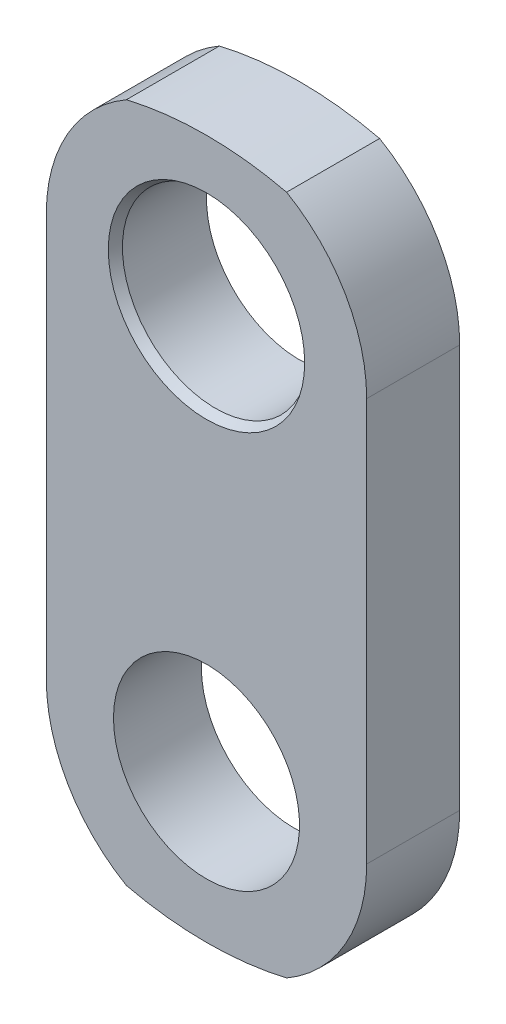
ISO-10303-21;
HEADER;
FILE_DESCRIPTION(('STEP AP214'),'2;1');
FILE_NAME('part.step','',(''),(''),'','','');
FILE_SCHEMA(('AUTOMOTIVE_DESIGN { 1 0 10303 214 1 1 1 1 }'));
ENDSEC;
DATA;
#1=APPLICATION_CONTEXT('core data for automotive mechanical design processes');
#2=APPLICATION_PROTOCOL_DEFINITION('international standard','automotive_design',2000,#1);
#3=PRODUCT_CONTEXT('',#1,'mechanical');
#4=PRODUCT('Part','Part','',(#3));
#5=PRODUCT_RELATED_PRODUCT_CATEGORY('part','',(#4));
#6=PRODUCT_DEFINITION_FORMATION('','',#4);
#7=PRODUCT_DEFINITION_CONTEXT('part definition',#1,'design');
#8=PRODUCT_DEFINITION('design','',#6,#7);
#9=PRODUCT_DEFINITION_SHAPE('','',#8);
#10=(LENGTH_UNIT() NAMED_UNIT(*) SI_UNIT(.MILLI.,.METRE.));
#11=(NAMED_UNIT(*) PLANE_ANGLE_UNIT() SI_UNIT($,.RADIAN.));
#12=(NAMED_UNIT(*) SI_UNIT($,.STERADIAN.) SOLID_ANGLE_UNIT());
#13=UNCERTAINTY_MEASURE_WITH_UNIT(LENGTH_MEASURE(1.E-05),#10,'distance_accuracy_value','');
#14=(GEOMETRIC_REPRESENTATION_CONTEXT(3) GLOBAL_UNCERTAINTY_ASSIGNED_CONTEXT((#13)) GLOBAL_UNIT_ASSIGNED_CONTEXT((#10,
#11,#12)) REPRESENTATION_CONTEXT('',''));
#15=CARTESIAN_POINT('',(0.,0.,0.));
#16=DIRECTION('',(0.,0.,1.));
#17=DIRECTION('',(1.,0.,0.));
#18=AXIS2_PLACEMENT_3D('',#15,#16,#17);
#19=CARTESIAN_POINT('',(0.,39.,18.));
#20=DIRECTION('',(0.,0.,1.));
#21=DIRECTION('',(1.,0.,0.));
#22=AXIS2_PLACEMENT_3D('',#19,#20,#21);
#23=PLANE('',#22);
#24=CARTESIAN_POINT('',(0.,39.,18.));
#25=DIRECTION('',(0.,0.,1.));
#26=DIRECTION('',(1.,0.,0.));
#27=AXIS2_PLACEMENT_3D('',#24,#25,#26);
#28=CIRCLE('',#27,19.);
#29=CARTESIAN_POINT('',(19.,39.,18.));
#30=VERTEX_POINT('',#29);
#31=EDGE_CURVE('E166',#30,#30,#28,.F.);
#32=ORIENTED_EDGE('',*,*,#31,.T.);
#33=EDGE_LOOP('',(#32));
#34=FACE_BOUND('',#33,.T.);
#35=CARTESIAN_POINT('',(0.,39.,18.));
#36=DIRECTION('',(0.,0.,1.));
#37=DIRECTION('',(1.,0.,0.));
#38=AXIS2_PLACEMENT_3D('',#35,#36,#37);
#39=CIRCLE('',#38,31.);
#40=CARTESIAN_POINT('',(31.,39.,18.));
#41=VERTEX_POINT('',#40);
#42=CARTESIAN_POINT('',(15.4999999999999,65.8467875173176,18.));
#43=VERTEX_POINT('',#42);
#44=EDGE_CURVE('E148',#41,#43,#39,.T.);
#45=ORIENTED_EDGE('',*,*,#44,.T.);
#46=CARTESIAN_POINT('',(0.,0.,18.));
#47=DIRECTION('',(0.,0.,1.));
#48=DIRECTION('',(1.,0.,0.));
#49=AXIS2_PLACEMENT_3D('',#46,#47,#48);
#50=CIRCLE('',#49,67.6465034303383);
#51=CARTESIAN_POINT('',(-15.4999999999999,65.8467875173176,18.));
#52=VERTEX_POINT('',#51);
#53=EDGE_CURVE('E96',#43,#52,#50,.T.);
#54=ORIENTED_EDGE('',*,*,#53,.T.);
#55=CARTESIAN_POINT('',(0.,39.,18.));
#56=DIRECTION('',(0.,0.,1.));
#57=DIRECTION('',(1.,0.,0.));
#58=AXIS2_PLACEMENT_3D('',#55,#56,#57);
#59=CIRCLE('',#58,31.);
#60=CARTESIAN_POINT('',(-31.,39.,18.));
#61=VERTEX_POINT('',#60);
#62=EDGE_CURVE('E229',#52,#61,#59,.T.);
#63=ORIENTED_EDGE('',*,*,#62,.T.);
#64=DIRECTION('',(0.,-1.,0.));
#65=VECTOR('',#64,1.);
#66=CARTESIAN_POINT('',(-31.,39.,18.));
#67=LINE('',#66,#65);
#68=CARTESIAN_POINT('',(-31.,-39.,18.));
#69=VERTEX_POINT('',#68);
#70=EDGE_CURVE('E231',#61,#69,#67,.T.);
#71=ORIENTED_EDGE('',*,*,#70,.T.);
#72=CARTESIAN_POINT('',(0.,-39.,18.));
#73=DIRECTION('',(0.,0.,1.));
#74=DIRECTION('',(-1.,0.,0.));
#75=AXIS2_PLACEMENT_3D('',#72,#73,#74);
#76=CIRCLE('',#75,31.);
#77=CARTESIAN_POINT('',(-15.4999999999999,-65.8467875173176,18.));
#78=VERTEX_POINT('',#77);
#79=EDGE_CURVE('E115',#69,#78,#76,.T.);
#80=ORIENTED_EDGE('',*,*,#79,.T.);
#81=CARTESIAN_POINT('',(0.,0.,18.));
#82=DIRECTION('',(0.,0.,1.));
#83=DIRECTION('',(-1.,0.,0.));
#84=AXIS2_PLACEMENT_3D('',#81,#82,#83);
#85=CIRCLE('',#84,67.6465034303383);
#86=CARTESIAN_POINT('',(15.4999999999999,-65.8467875173176,18.));
#87=VERTEX_POINT('',#86);
#88=EDGE_CURVE('E109',#78,#87,#85,.T.);
#89=ORIENTED_EDGE('',*,*,#88,.T.);
#90=CARTESIAN_POINT('',(0.,-39.,18.));
#91=DIRECTION('',(0.,0.,1.));
#92=DIRECTION('',(-1.,0.,0.));
#93=AXIS2_PLACEMENT_3D('',#90,#91,#92);
#94=CIRCLE('',#93,31.);
#95=CARTESIAN_POINT('',(31.,-39.,18.));
#96=VERTEX_POINT('',#95);
#97=EDGE_CURVE('E113',#87,#96,#94,.T.);
#98=ORIENTED_EDGE('',*,*,#97,.T.);
#99=DIRECTION('',(0.,1.,0.));
#100=VECTOR('',#99,1.);
#101=CARTESIAN_POINT('',(31.,39.,18.));
#102=LINE('',#101,#100);
#103=EDGE_CURVE('E52',#96,#41,#102,.T.);
#104=ORIENTED_EDGE('',*,*,#103,.T.);
#105=EDGE_LOOP('',(#45,#54,#63,#71,#80,#89,#98,#104));
#106=FACE_BOUND('',#105,.T.);
#107=CARTESIAN_POINT('',(0.,-39.,18.));
#108=DIRECTION('',(0.,0.,1.));
#109=DIRECTION('',(-1.,0.,0.));
#110=AXIS2_PLACEMENT_3D('',#107,#108,#109);
#111=CIRCLE('',#110,18.);
#112=CARTESIAN_POINT('',(-18.,-39.,18.));
#113=VERTEX_POINT('',#112);
#114=EDGE_CURVE('E239',#113,#113,#111,.T.);
#115=ORIENTED_EDGE('',*,*,#114,.F.);
#116=EDGE_LOOP('',(#115));
#117=FACE_BOUND('',#116,.T.);
#118=ADVANCED_FACE('F35',(#34,#106,#117),#23,.T.);
#119=CARTESIAN_POINT('',(0.,39.,0.));
#120=DIRECTION('',(0.,0.,1.));
#121=DIRECTION('',(1.,0.,0.));
#122=AXIS2_PLACEMENT_3D('',#119,#120,#121);
#123=PLANE('',#122);
#124=CARTESIAN_POINT('',(0.,-39.,0.));
#125=DIRECTION('',(0.,0.,1.));
#126=DIRECTION('',(1.,0.,0.));
#127=AXIS2_PLACEMENT_3D('',#124,#125,#126);
#128=CIRCLE('',#127,19.7320508075689);
#129=CARTESIAN_POINT('',(19.7320508075689,-39.,0.));
#130=VERTEX_POINT('',#129);
#131=EDGE_CURVE('E44',#130,#130,#128,.T.);
#132=ORIENTED_EDGE('',*,*,#131,.T.);
#133=EDGE_LOOP('',(#132));
#134=FACE_BOUND('',#133,.T.);
#135=CARTESIAN_POINT('',(0.,39.,0.));
#136=DIRECTION('',(0.,0.,1.));
#137=DIRECTION('',(1.,0.,0.));
#138=AXIS2_PLACEMENT_3D('',#135,#136,#137);
#139=CIRCLE('',#138,31.);
#140=CARTESIAN_POINT('',(31.,39.,0.));
#141=VERTEX_POINT('',#140);
#142=CARTESIAN_POINT('',(15.4999999999999,65.8467875173176,0.));
#143=VERTEX_POINT('',#142);
#144=EDGE_CURVE('E133',#141,#143,#139,.T.);
#145=ORIENTED_EDGE('',*,*,#144,.F.);
#146=DIRECTION('',(0.,1.,0.));
#147=VECTOR('',#146,1.);
#148=CARTESIAN_POINT('',(31.,39.,0.));
#149=LINE('',#148,#147);
#150=CARTESIAN_POINT('',(31.,-39.,0.));
#151=VERTEX_POINT('',#150);
#152=EDGE_CURVE('E87',#151,#141,#149,.T.);
#153=ORIENTED_EDGE('',*,*,#152,.F.);
#154=CARTESIAN_POINT('',(0.,-39.,0.));
#155=DIRECTION('',(0.,0.,1.));
#156=DIRECTION('',(-1.,0.,0.));
#157=AXIS2_PLACEMENT_3D('',#154,#155,#156);
#158=CIRCLE('',#157,31.);
#159=CARTESIAN_POINT('',(15.4999999999999,-65.8467875173176,0.));
#160=VERTEX_POINT('',#159);
#161=EDGE_CURVE('E81',#160,#151,#158,.T.);
#162=ORIENTED_EDGE('',*,*,#161,.F.);
#163=CARTESIAN_POINT('',(0.,0.,0.));
#164=DIRECTION('',(0.,0.,1.));
#165=DIRECTION('',(-1.,0.,0.));
#166=AXIS2_PLACEMENT_3D('',#163,#164,#165);
#167=CIRCLE('',#166,67.6465034303383);
#168=CARTESIAN_POINT('',(-15.4999999999999,-65.8467875173176,0.));
#169=VERTEX_POINT('',#168);
#170=EDGE_CURVE('E123',#169,#160,#167,.T.);
#171=ORIENTED_EDGE('',*,*,#170,.F.);
#172=CARTESIAN_POINT('',(0.,-39.,0.));
#173=DIRECTION('',(0.,0.,1.));
#174=DIRECTION('',(-1.,0.,0.));
#175=AXIS2_PLACEMENT_3D('',#172,#173,#174);
#176=CIRCLE('',#175,31.);
#177=CARTESIAN_POINT('',(-31.,-39.,0.));
#178=VERTEX_POINT('',#177);
#179=EDGE_CURVE('E143',#178,#169,#176,.T.);
#180=ORIENTED_EDGE('',*,*,#179,.F.);
#181=DIRECTION('',(0.,-1.,0.));
#182=VECTOR('',#181,1.);
#183=CARTESIAN_POINT('',(-31.,39.,0.));
#184=LINE('',#183,#182);
#185=CARTESIAN_POINT('',(-31.,39.,0.));
#186=VERTEX_POINT('',#185);
#187=EDGE_CURVE('E141',#186,#178,#184,.T.);
#188=ORIENTED_EDGE('',*,*,#187,.F.);
#189=CARTESIAN_POINT('',(0.,39.,0.));
#190=DIRECTION('',(0.,0.,1.));
#191=DIRECTION('',(1.,0.,0.));
#192=AXIS2_PLACEMENT_3D('',#189,#190,#191);
#193=CIRCLE('',#192,31.);
#194=CARTESIAN_POINT('',(-15.4999999999999,65.8467875173176,0.));
#195=VERTEX_POINT('',#194);
#196=EDGE_CURVE('E139',#195,#186,#193,.T.);
#197=ORIENTED_EDGE('',*,*,#196,.F.);
#198=CARTESIAN_POINT('',(0.,0.,0.));
#199=DIRECTION('',(0.,0.,1.));
#200=DIRECTION('',(1.,0.,0.));
#201=AXIS2_PLACEMENT_3D('',#198,#199,#200);
#202=CIRCLE('',#201,67.6465034303383);
#203=EDGE_CURVE('E136',#143,#195,#202,.T.);
#204=ORIENTED_EDGE('',*,*,#203,.F.);
#205=EDGE_LOOP('',(#145,#153,#162,#171,#180,#188,#197,#204));
#206=FACE_BOUND('',#205,.T.);
#207=CARTESIAN_POINT('',(0.,39.,0.));
#208=DIRECTION('',(0.,0.,1.));
#209=DIRECTION('',(1.,0.,0.));
#210=AXIS2_PLACEMENT_3D('',#207,#208,#209);
#211=CIRCLE('',#210,18.);
#212=CARTESIAN_POINT('',(18.,39.,0.));
#213=VERTEX_POINT('',#212);
#214=EDGE_CURVE('E137',#213,#213,#211,.T.);
#215=ORIENTED_EDGE('',*,*,#214,.T.);
#216=EDGE_LOOP('',(#215));
#217=FACE_BOUND('',#216,.T.);
#218=ADVANCED_FACE('F171',(#134,#206,#217),#123,.F.);
#219=CARTESIAN_POINT('',(0.,39.,18.));
#220=DIRECTION('',(0.,0.,-1.));
#221=DIRECTION('',(-1.,0.,0.));
#222=AXIS2_PLACEMENT_3D('',#219,#220,#221);
#223=CYLINDRICAL_SURFACE('',#222,31.);
#224=ORIENTED_EDGE('',*,*,#144,.T.);
#225=DIRECTION('',(0.,0.,-1.));
#226=VECTOR('',#225,1.);
#227=CARTESIAN_POINT('',(15.4999999999999,65.8467875173176,18.));
#228=LINE('',#227,#226);
#229=EDGE_CURVE('E161',#43,#143,#228,.T.);
#230=ORIENTED_EDGE('',*,*,#229,.F.);
#231=ORIENTED_EDGE('',*,*,#44,.F.);
#232=DIRECTION('',(0.,0.,-1.));
#233=VECTOR('',#232,1.);
#234=CARTESIAN_POINT('',(31.,39.,18.));
#235=LINE('',#234,#233);
#236=EDGE_CURVE('E129',#41,#141,#235,.T.);
#237=ORIENTED_EDGE('',*,*,#236,.T.);
#238=EDGE_LOOP('',(#224,#230,#231,#237));
#239=FACE_BOUND('',#238,.T.);
#240=ADVANCED_FACE('F189',(#239),#223,.T.);
#241=CARTESIAN_POINT('',(0.,0.,18.));
#242=DIRECTION('',(0.,0.,-1.));
#243=DIRECTION('',(-1.,0.,0.));
#244=AXIS2_PLACEMENT_3D('',#241,#242,#243);
#245=CYLINDRICAL_SURFACE('',#244,67.6465034303383);
#246=ORIENTED_EDGE('',*,*,#203,.T.);
#247=DIRECTION('',(0.,0.,-1.));
#248=VECTOR('',#247,1.);
#249=CARTESIAN_POINT('',(-15.4999999999999,65.8467875173176,18.));
#250=LINE('',#249,#248);
#251=EDGE_CURVE('E158',#52,#195,#250,.T.);
#252=ORIENTED_EDGE('',*,*,#251,.F.);
#253=ORIENTED_EDGE('',*,*,#53,.F.);
#254=ORIENTED_EDGE('',*,*,#229,.T.);
#255=EDGE_LOOP('',(#246,#252,#253,#254));
#256=FACE_BOUND('',#255,.T.);
#257=ADVANCED_FACE('F213',(#256),#245,.T.);
#258=CARTESIAN_POINT('',(0.,39.,18.));
#259=DIRECTION('',(0.,0.,-1.));
#260=DIRECTION('',(-1.,0.,0.));
#261=AXIS2_PLACEMENT_3D('',#258,#259,#260);
#262=CYLINDRICAL_SURFACE('',#261,31.);
#263=ORIENTED_EDGE('',*,*,#196,.T.);
#264=DIRECTION('',(0.,0.,-1.));
#265=VECTOR('',#264,1.);
#266=CARTESIAN_POINT('',(-31.,39.,18.));
#267=LINE('',#266,#265);
#268=EDGE_CURVE('E155',#61,#186,#267,.T.);
#269=ORIENTED_EDGE('',*,*,#268,.F.);
#270=ORIENTED_EDGE('',*,*,#62,.F.);
#271=ORIENTED_EDGE('',*,*,#251,.T.);
#272=EDGE_LOOP('',(#263,#269,#270,#271));
#273=FACE_BOUND('',#272,.T.);
#274=ADVANCED_FACE('F209',(#273),#262,.T.);
#275=CARTESIAN_POINT('',(-31.,39.,18.));
#276=DIRECTION('',(1.,0.,0.));
#277=DIRECTION('',(0.,0.,-1.));
#278=AXIS2_PLACEMENT_3D('',#275,#276,#277);
#279=PLANE('',#278);
#280=ORIENTED_EDGE('',*,*,#187,.T.);
#281=DIRECTION('',(0.,0.,-1.));
#282=VECTOR('',#281,1.);
#283=CARTESIAN_POINT('',(-31.,-39.,18.));
#284=LINE('',#283,#282);
#285=EDGE_CURVE('E152',#69,#178,#284,.T.);
#286=ORIENTED_EDGE('',*,*,#285,.F.);
#287=ORIENTED_EDGE('',*,*,#70,.F.);
#288=ORIENTED_EDGE('',*,*,#268,.T.);
#289=EDGE_LOOP('',(#280,#286,#287,#288));
#290=FACE_BOUND('',#289,.T.);
#291=ADVANCED_FACE('F205',(#290),#279,.F.);
#292=CARTESIAN_POINT('',(0.,-39.,18.));
#293=DIRECTION('',(0.,0.,-1.));
#294=DIRECTION('',(-1.,0.,0.));
#295=AXIS2_PLACEMENT_3D('',#292,#293,#294);
#296=CYLINDRICAL_SURFACE('',#295,31.);
#297=ORIENTED_EDGE('',*,*,#179,.T.);
#298=DIRECTION('',(0.,0.,-1.));
#299=VECTOR('',#298,1.);
#300=CARTESIAN_POINT('',(-15.4999999999999,-65.8467875173176,18.));
#301=LINE('',#300,#299);
#302=EDGE_CURVE('E124',#78,#169,#301,.T.);
#303=ORIENTED_EDGE('',*,*,#302,.F.);
#304=ORIENTED_EDGE('',*,*,#79,.F.);
#305=ORIENTED_EDGE('',*,*,#285,.T.);
#306=EDGE_LOOP('',(#297,#303,#304,#305));
#307=FACE_BOUND('',#306,.T.);
#308=ADVANCED_FACE('F202',(#307),#296,.T.);
#309=CARTESIAN_POINT('',(0.,0.,18.));
#310=DIRECTION('',(0.,0.,-1.));
#311=DIRECTION('',(-1.,0.,0.));
#312=AXIS2_PLACEMENT_3D('',#309,#310,#311);
#313=CYLINDRICAL_SURFACE('',#312,67.6465034303383);
#314=ORIENTED_EDGE('',*,*,#170,.T.);
#315=DIRECTION('',(0.,0.,-1.));
#316=VECTOR('',#315,1.);
#317=CARTESIAN_POINT('',(15.4999999999999,-65.8467875173176,18.));
#318=LINE('',#317,#316);
#319=EDGE_CURVE('E120',#87,#160,#318,.T.);
#320=ORIENTED_EDGE('',*,*,#319,.F.);
#321=ORIENTED_EDGE('',*,*,#88,.F.);
#322=ORIENTED_EDGE('',*,*,#302,.T.);
#323=EDGE_LOOP('',(#314,#320,#321,#322));
#324=FACE_BOUND('',#323,.T.);
#325=ADVANCED_FACE('F121',(#324),#313,.T.);
#326=CARTESIAN_POINT('',(0.,-39.,18.));
#327=DIRECTION('',(0.,0.,-1.));
#328=DIRECTION('',(-1.,0.,0.));
#329=AXIS2_PLACEMENT_3D('',#326,#327,#328);
#330=CYLINDRICAL_SURFACE('',#329,31.);
#331=ORIENTED_EDGE('',*,*,#161,.T.);
#332=DIRECTION('',(0.,0.,-1.));
#333=VECTOR('',#332,1.);
#334=CARTESIAN_POINT('',(31.,-39.,18.));
#335=LINE('',#334,#333);
#336=EDGE_CURVE('E125',#96,#151,#335,.T.);
#337=ORIENTED_EDGE('',*,*,#336,.F.);
#338=ORIENTED_EDGE('',*,*,#97,.F.);
#339=ORIENTED_EDGE('',*,*,#319,.T.);
#340=EDGE_LOOP('',(#331,#337,#338,#339));
#341=FACE_BOUND('',#340,.T.);
#342=ADVANCED_FACE('F127',(#341),#330,.T.);
#343=CARTESIAN_POINT('',(31.,39.,18.));
#344=DIRECTION('',(-1.,0.,0.));
#345=DIRECTION('',(0.,0.,1.));
#346=AXIS2_PLACEMENT_3D('',#343,#344,#345);
#347=PLANE('',#346);
#348=ORIENTED_EDGE('',*,*,#152,.T.);
#349=ORIENTED_EDGE('',*,*,#236,.F.);
#350=ORIENTED_EDGE('',*,*,#103,.F.);
#351=ORIENTED_EDGE('',*,*,#336,.T.);
#352=EDGE_LOOP('',(#348,#349,#350,#351));
#353=FACE_BOUND('',#352,.T.);
#354=ADVANCED_FACE('F195',(#353),#347,.F.);
#355=CARTESIAN_POINT('',(0.,39.,18.));
#356=DIRECTION('',(0.,0.,-1.));
#357=DIRECTION('',(-1.,0.,0.));
#358=AXIS2_PLACEMENT_3D('',#355,#356,#357);
#359=CYLINDRICAL_SURFACE('',#358,18.);
#360=CARTESIAN_POINT('',(0.,39.,16.2679491924311));
#361=DIRECTION('',(0.,0.,1.));
#362=DIRECTION('',(1.,0.,0.));
#363=AXIS2_PLACEMENT_3D('',#360,#361,#362);
#364=CIRCLE('',#363,18.);
#365=CARTESIAN_POINT('',(18.,39.,16.2679491924311));
#366=VERTEX_POINT('',#365);
#367=EDGE_CURVE('E163',#366,#366,#364,.T.);
#368=ORIENTED_EDGE('',*,*,#367,.T.);
#369=EDGE_LOOP('',(#368));
#370=FACE_BOUND('',#369,.T.);
#371=ORIENTED_EDGE('',*,*,#214,.F.);
#372=EDGE_LOOP('',(#371));
#373=FACE_BOUND('',#372,.T.);
#374=ADVANCED_FACE('F192',(#370,#373),#359,.F.);
#375=CARTESIAN_POINT('',(0.,-39.,18.));
#376=DIRECTION('',(0.,0.,-1.));
#377=DIRECTION('',(-1.,0.,0.));
#378=AXIS2_PLACEMENT_3D('',#375,#376,#377);
#379=CYLINDRICAL_SURFACE('',#378,18.);
#380=CARTESIAN_POINT('',(0.,-39.,1.00000000000003));
#381=DIRECTION('',(0.,0.,1.));
#382=DIRECTION('',(1.,0.,0.));
#383=AXIS2_PLACEMENT_3D('',#380,#381,#382);
#384=CIRCLE('',#383,18.);
#385=CARTESIAN_POINT('',(18.,-39.,1.00000000000003));
#386=VERTEX_POINT('',#385);
#387=EDGE_CURVE('E11',#386,#386,#384,.F.);
#388=ORIENTED_EDGE('',*,*,#387,.T.);
#389=EDGE_LOOP('',(#388));
#390=FACE_BOUND('',#389,.T.);
#391=ORIENTED_EDGE('',*,*,#114,.T.);
#392=EDGE_LOOP('',(#391));
#393=FACE_BOUND('',#392,.T.);
#394=ADVANCED_FACE('F180',(#390,#393),#379,.F.);
#395=CARTESIAN_POINT('',(0.,39.,16.2679491924311));
#396=DIRECTION('',(0.,0.,1.));
#397=DIRECTION('',(1.,0.,0.));
#398=AXIS2_PLACEMENT_3D('',#395,#396,#397);
#399=CONICAL_SURFACE('',#398,18.,0.523598775598302);
#400=ORIENTED_EDGE('',*,*,#31,.F.);
#401=EDGE_LOOP('',(#400));
#402=FACE_BOUND('',#401,.T.);
#403=ORIENTED_EDGE('',*,*,#367,.F.);
#404=EDGE_LOOP('',(#403));
#405=FACE_BOUND('',#404,.T.);
#406=ADVANCED_FACE('F175',(#402,#405),#399,.F.);
#407=CARTESIAN_POINT('',(0.,-39.,0.));
#408=DIRECTION('',(0.,0.,-1.));
#409=DIRECTION('',(-1.,0.,0.));
#410=AXIS2_PLACEMENT_3D('',#407,#408,#409);
#411=CONICAL_SURFACE('',#410,19.7320508075689,1.04719755119659);
#412=ORIENTED_EDGE('',*,*,#387,.F.);
#413=EDGE_LOOP('',(#412));
#414=FACE_BOUND('',#413,.T.);
#415=ORIENTED_EDGE('',*,*,#131,.F.);
#416=EDGE_LOOP('',(#415));
#417=FACE_BOUND('',#416,.T.);
#418=ADVANCED_FACE('F37',(#414,#417),#411,.F.);
#419=CLOSED_SHELL('',(#118,#218,#240,#257,#274,#291,#308,#325,#342,#354,#374,#394,#406,#418));
#420=MANIFOLD_SOLID_BREP('B2',#419);
#421=ADVANCED_BREP_SHAPE_REPRESENTATION('',(#18,#420),#14);
#422=SHAPE_DEFINITION_REPRESENTATION(#9,#421);
ENDSEC;
END-ISO-10303-21;
